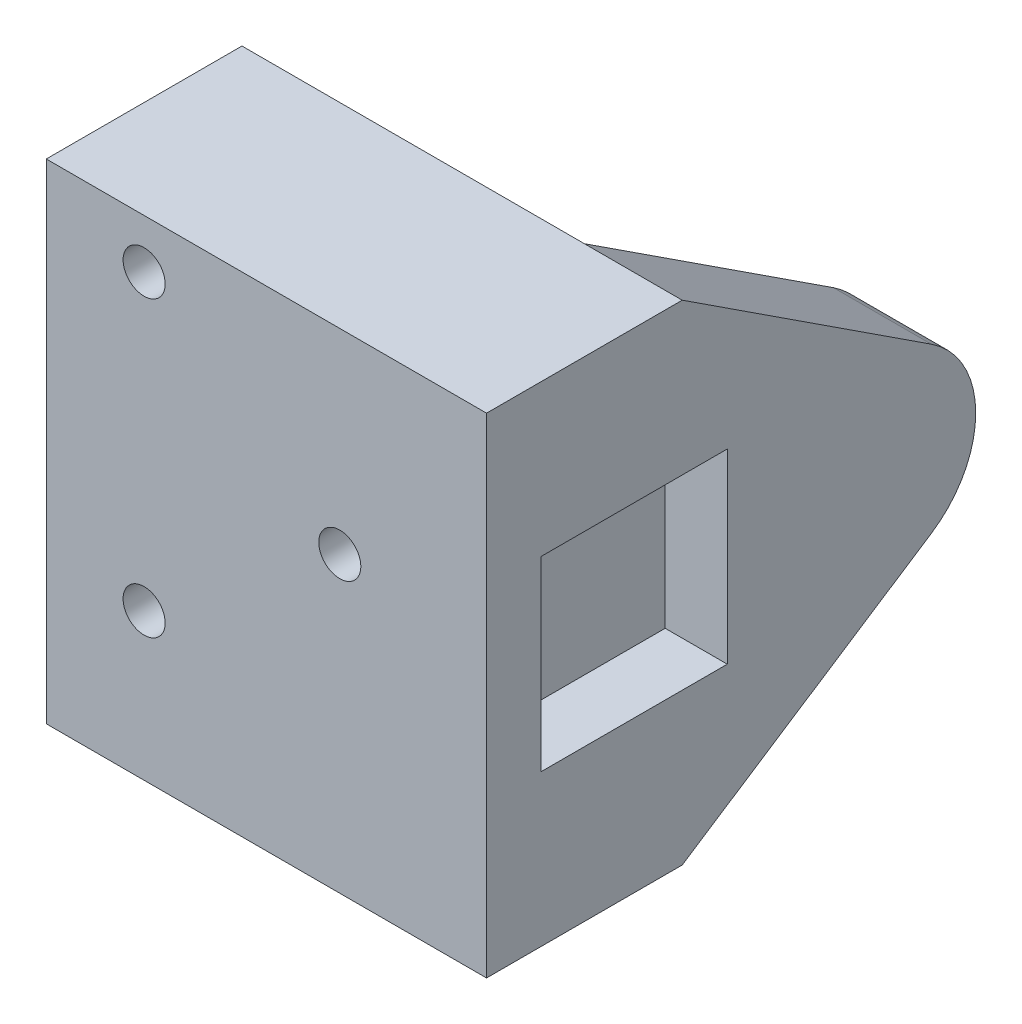
ISO-10303-21;
HEADER;
FILE_DESCRIPTION(('STEP AP214'),'2;1');
FILE_NAME('part.step','',(''),(''),'','','');
FILE_SCHEMA(('AUTOMOTIVE_DESIGN { 1 0 10303 214 1 1 1 1 }'));
ENDSEC;
DATA;
#1=APPLICATION_CONTEXT('core data for automotive mechanical design processes');
#2=APPLICATION_PROTOCOL_DEFINITION('international standard','automotive_design',2000,#1);
#3=PRODUCT_CONTEXT('',#1,'mechanical');
#4=PRODUCT('Part','Part','',(#3));
#5=PRODUCT_RELATED_PRODUCT_CATEGORY('part','',(#4));
#6=PRODUCT_DEFINITION_FORMATION('','',#4);
#7=PRODUCT_DEFINITION_CONTEXT('part definition',#1,'design');
#8=PRODUCT_DEFINITION('design','',#6,#7);
#9=PRODUCT_DEFINITION_SHAPE('','',#8);
#10=(LENGTH_UNIT() NAMED_UNIT(*) SI_UNIT(.MILLI.,.METRE.));
#11=(NAMED_UNIT(*) PLANE_ANGLE_UNIT() SI_UNIT($,.RADIAN.));
#12=(NAMED_UNIT(*) SI_UNIT($,.STERADIAN.) SOLID_ANGLE_UNIT());
#13=UNCERTAINTY_MEASURE_WITH_UNIT(LENGTH_MEASURE(1.E-05),#10,'distance_accuracy_value','');
#14=(GEOMETRIC_REPRESENTATION_CONTEXT(3) GLOBAL_UNCERTAINTY_ASSIGNED_CONTEXT((#13)) GLOBAL_UNIT_ASSIGNED_CONTEXT((#10,
#11,#12)) REPRESENTATION_CONTEXT('',''));
#15=CARTESIAN_POINT('',(0.,0.,0.));
#16=DIRECTION('',(0.,0.,1.));
#17=DIRECTION('',(1.,0.,0.));
#18=AXIS2_PLACEMENT_3D('',#15,#16,#17);
#19=CARTESIAN_POINT('',(0.,0.,0.));
#20=DIRECTION('',(1.,0.,0.));
#21=DIRECTION('',(0.,0.,-1.));
#22=AXIS2_PLACEMENT_3D('',#19,#20,#21);
#23=PLANE('',#22);
#24=DIRECTION('',(0.,-1.,0.));
#25=VECTOR('',#24,1.);
#26=CARTESIAN_POINT('',(0.,25.,0.));
#27=LINE('',#26,#25);
#28=CARTESIAN_POINT('',(0.,25.,0.));
#29=VERTEX_POINT('',#28);
#30=CARTESIAN_POINT('',(0.,-25.,0.));
#31=VERTEX_POINT('',#30);
#32=EDGE_CURVE('E83',#29,#31,#27,.T.);
#33=ORIENTED_EDGE('',*,*,#32,.F.);
#34=DIRECTION('',(0.,-0.546678357353442,-0.837342685882753));
#35=VECTOR('',#34,1.);
#36=CARTESIAN_POINT('',(0.,17.5285693400336,-11.4439281015076));
#37=LINE('',#36,#35);
#38=CARTESIAN_POINT('',(0.,8.37342685882754,-25.4667835735344));
#39=VERTEX_POINT('',#38);
#40=EDGE_CURVE('E109',#29,#39,#37,.T.);
#41=ORIENTED_EDGE('',*,*,#40,.T.);
#42=CARTESIAN_POINT('',(0.,0.,-20.));
#43=DIRECTION('',(1.,0.,0.));
#44=DIRECTION('',(0.,0.,-1.));
#45=AXIS2_PLACEMENT_3D('',#42,#43,#44);
#46=CIRCLE('',#45,10.);
#47=CARTESIAN_POINT('',(0.,-8.37342685882754,-25.4667835735344));
#48=VERTEX_POINT('',#47);
#49=EDGE_CURVE('E134',#39,#48,#46,.F.);
#50=ORIENTED_EDGE('',*,*,#49,.T.);
#51=DIRECTION('',(0.,-0.546678357353442,0.837342685882753));
#52=VECTOR('',#51,1.);
#53=CARTESIAN_POINT('',(0.,-17.5285693400336,-11.4439281015076));
#54=LINE('',#53,#52);
#55=EDGE_CURVE('E132',#48,#31,#54,.T.);
#56=ORIENTED_EDGE('',*,*,#55,.T.);
#57=EDGE_LOOP('',(#33,#41,#50,#56));
#58=FACE_BOUND('',#57,.T.);
#59=ADVANCED_FACE('F37',(#58),#23,.F.);
#60=CARTESIAN_POINT('',(10.,-25.,0.));
#61=DIRECTION('',(0.,1.,0.));
#62=DIRECTION('',(0.,0.,1.));
#63=AXIS2_PLACEMENT_3D('',#60,#61,#62);
#64=PLANE('',#63);
#65=DIRECTION('',(-1.,0.,0.));
#66=VECTOR('',#65,1.);
#67=CARTESIAN_POINT('',(10.,-25.,20.));
#68=LINE('',#67,#66);
#69=CARTESIAN_POINT('',(10.,-25.,20.));
#70=VERTEX_POINT('',#69);
#71=CARTESIAN_POINT('',(-35.,-25.,20.));
#72=VERTEX_POINT('',#71);
#73=EDGE_CURVE('E63',#70,#72,#68,.T.);
#74=ORIENTED_EDGE('',*,*,#73,.T.);
#75=DIRECTION('',(0.,0.,1.));
#76=VECTOR('',#75,1.);
#77=CARTESIAN_POINT('',(-35.,-25.,0.));
#78=LINE('',#77,#76);
#79=CARTESIAN_POINT('',(-35.,-25.,0.));
#80=VERTEX_POINT('',#79);
#81=EDGE_CURVE('E164',#80,#72,#78,.T.);
#82=ORIENTED_EDGE('',*,*,#81,.F.);
#83=DIRECTION('',(1.,0.,0.));
#84=VECTOR('',#83,1.);
#85=CARTESIAN_POINT('',(-35.,-25.,0.));
#86=LINE('',#85,#84);
#87=EDGE_CURVE('E176',#80,#31,#86,.T.);
#88=ORIENTED_EDGE('',*,*,#87,.T.);
#89=DIRECTION('',(-1.,0.,0.));
#90=VECTOR('',#89,1.);
#91=CARTESIAN_POINT('',(10.,-25.,0.));
#92=LINE('',#91,#90);
#93=CARTESIAN_POINT('',(10.,-25.,0.));
#94=VERTEX_POINT('',#93);
#95=EDGE_CURVE('E11',#94,#31,#92,.T.);
#96=ORIENTED_EDGE('',*,*,#95,.F.);
#97=DIRECTION('',(0.,0.,-1.));
#98=VECTOR('',#97,1.);
#99=CARTESIAN_POINT('',(10.,-25.,0.));
#100=LINE('',#99,#98);
#101=EDGE_CURVE('E91',#70,#94,#100,.T.);
#102=ORIENTED_EDGE('',*,*,#101,.F.);
#103=EDGE_LOOP('',(#74,#82,#88,#96,#102));
#104=FACE_BOUND('',#103,.T.);
#105=ADVANCED_FACE('F39',(#104),#64,.F.);
#106=CARTESIAN_POINT('',(10.,-17.5285693400336,-11.4439281015076));
#107=DIRECTION('',(0.,-0.837342685882753,-0.546678357353442));
#108=DIRECTION('',(0.,0.546678357353442,-0.837342685882753));
#109=AXIS2_PLACEMENT_3D('',#106,#107,#108);
#110=PLANE('',#109);
#111=ORIENTED_EDGE('',*,*,#55,.F.);
#112=DIRECTION('',(-1.,0.,0.));
#113=VECTOR('',#112,1.);
#114=CARTESIAN_POINT('',(10.,-8.37342685882754,-25.4667835735344));
#115=LINE('',#114,#113);
#116=CARTESIAN_POINT('',(10.,-8.37342685882754,-25.4667835735344));
#117=VERTEX_POINT('',#116);
#118=EDGE_CURVE('E46',#117,#48,#115,.T.);
#119=ORIENTED_EDGE('',*,*,#118,.F.);
#120=DIRECTION('',(0.,-0.546678357353442,0.837342685882753));
#121=VECTOR('',#120,1.);
#122=CARTESIAN_POINT('',(10.,-17.5285693400336,-11.4439281015076));
#123=LINE('',#122,#121);
#124=EDGE_CURVE('E211',#117,#94,#123,.T.);
#125=ORIENTED_EDGE('',*,*,#124,.T.);
#126=ORIENTED_EDGE('',*,*,#95,.T.);
#127=EDGE_LOOP('',(#111,#119,#125,#126));
#128=FACE_BOUND('',#127,.T.);
#129=ADVANCED_FACE('F222',(#128),#110,.T.);
#130=CARTESIAN_POINT('',(10.,0.,-20.));
#131=DIRECTION('',(-1.,0.,0.));
#132=DIRECTION('',(0.,0.,1.));
#133=AXIS2_PLACEMENT_3D('',#130,#131,#132);
#134=CYLINDRICAL_SURFACE('',#133,10.);
#135=ORIENTED_EDGE('',*,*,#49,.F.);
#136=DIRECTION('',(-1.,0.,0.));
#137=VECTOR('',#136,1.);
#138=CARTESIAN_POINT('',(10.,8.37342685882754,-25.4667835735344));
#139=LINE('',#138,#137);
#140=CARTESIAN_POINT('',(10.,8.37342685882754,-25.4667835735344));
#141=VERTEX_POINT('',#140);
#142=EDGE_CURVE('E114',#141,#39,#139,.T.);
#143=ORIENTED_EDGE('',*,*,#142,.F.);
#144=CARTESIAN_POINT('',(10.,0.,-20.));
#145=DIRECTION('',(1.,0.,0.));
#146=DIRECTION('',(0.,0.,-1.));
#147=AXIS2_PLACEMENT_3D('',#144,#145,#146);
#148=CIRCLE('',#147,10.);
#149=EDGE_CURVE('E122',#141,#117,#148,.F.);
#150=ORIENTED_EDGE('',*,*,#149,.T.);
#151=ORIENTED_EDGE('',*,*,#118,.T.);
#152=EDGE_LOOP('',(#135,#143,#150,#151));
#153=FACE_BOUND('',#152,.T.);
#154=ADVANCED_FACE('F215',(#153),#134,.T.);
#155=CARTESIAN_POINT('',(10.,17.5285693400336,-11.4439281015076));
#156=DIRECTION('',(0.,0.837342685882753,-0.546678357353442));
#157=DIRECTION('',(0.,0.546678357353442,0.837342685882753));
#158=AXIS2_PLACEMENT_3D('',#155,#156,#157);
#159=PLANE('',#158);
#160=ORIENTED_EDGE('',*,*,#40,.F.);
#161=DIRECTION('',(-1.,0.,0.));
#162=VECTOR('',#161,1.);
#163=CARTESIAN_POINT('',(10.,25.,0.));
#164=LINE('',#163,#162);
#165=CARTESIAN_POINT('',(10.,25.,0.));
#166=VERTEX_POINT('',#165);
#167=EDGE_CURVE('E105',#166,#29,#164,.T.);
#168=ORIENTED_EDGE('',*,*,#167,.F.);
#169=DIRECTION('',(0.,-0.546678357353442,-0.837342685882753));
#170=VECTOR('',#169,1.);
#171=CARTESIAN_POINT('',(10.,17.5285693400336,-11.4439281015076));
#172=LINE('',#171,#170);
#173=EDGE_CURVE('E108',#166,#141,#172,.T.);
#174=ORIENTED_EDGE('',*,*,#173,.T.);
#175=ORIENTED_EDGE('',*,*,#142,.T.);
#176=EDGE_LOOP('',(#160,#168,#174,#175));
#177=FACE_BOUND('',#176,.T.);
#178=ADVANCED_FACE('F107',(#177),#159,.T.);
#179=CARTESIAN_POINT('',(10.,25.,0.));
#180=DIRECTION('',(0.,1.,0.));
#181=DIRECTION('',(0.,0.,1.));
#182=AXIS2_PLACEMENT_3D('',#179,#180,#181);
#183=PLANE('',#182);
#184=ORIENTED_EDGE('',*,*,#167,.T.);
#185=DIRECTION('',(1.,0.,0.));
#186=VECTOR('',#185,1.);
#187=CARTESIAN_POINT('',(-35.,25.,0.));
#188=LINE('',#187,#186);
#189=CARTESIAN_POINT('',(-35.,25.,0.));
#190=VERTEX_POINT('',#189);
#191=EDGE_CURVE('E173',#190,#29,#188,.T.);
#192=ORIENTED_EDGE('',*,*,#191,.F.);
#193=DIRECTION('',(0.,0.,-1.));
#194=VECTOR('',#193,1.);
#195=CARTESIAN_POINT('',(-35.,25.,0.));
#196=LINE('',#195,#194);
#197=CARTESIAN_POINT('',(-35.,25.,20.));
#198=VERTEX_POINT('',#197);
#199=EDGE_CURVE('E170',#198,#190,#196,.T.);
#200=ORIENTED_EDGE('',*,*,#199,.F.);
#201=DIRECTION('',(-1.,0.,0.));
#202=VECTOR('',#201,1.);
#203=CARTESIAN_POINT('',(10.,25.,20.));
#204=LINE('',#203,#202);
#205=CARTESIAN_POINT('',(10.,25.,20.));
#206=VERTEX_POINT('',#205);
#207=EDGE_CURVE('E115',#206,#198,#204,.T.);
#208=ORIENTED_EDGE('',*,*,#207,.F.);
#209=DIRECTION('',(0.,0.,-1.));
#210=VECTOR('',#209,1.);
#211=CARTESIAN_POINT('',(10.,25.,0.));
#212=LINE('',#211,#210);
#213=EDGE_CURVE('E120',#206,#166,#212,.T.);
#214=ORIENTED_EDGE('',*,*,#213,.T.);
#215=EDGE_LOOP('',(#184,#192,#200,#208,#214));
#216=FACE_BOUND('',#215,.T.);
#217=ADVANCED_FACE('F124',(#216),#183,.T.);
#218=CARTESIAN_POINT('',(10.,0.,20.));
#219=DIRECTION('',(0.,0.,1.));
#220=DIRECTION('',(1.,0.,0.));
#221=AXIS2_PLACEMENT_3D('',#218,#219,#220);
#222=PLANE('',#221);
#223=CARTESIAN_POINT('',(-25.,20.,20.));
#224=DIRECTION('',(0.,0.,1.));
#225=DIRECTION('',(1.,0.,0.));
#226=AXIS2_PLACEMENT_3D('',#223,#224,#225);
#227=CIRCLE('',#226,2.15);
#228=CARTESIAN_POINT('',(-22.85,20.,20.));
#229=VERTEX_POINT('',#228);
#230=EDGE_CURVE('E156',#229,#229,#227,.T.);
#231=ORIENTED_EDGE('',*,*,#230,.F.);
#232=EDGE_LOOP('',(#231));
#233=FACE_BOUND('',#232,.T.);
#234=CARTESIAN_POINT('',(-25.,-10.,20.));
#235=DIRECTION('',(0.,0.,1.));
#236=DIRECTION('',(1.,0.,0.));
#237=AXIS2_PLACEMENT_3D('',#234,#235,#236);
#238=CIRCLE('',#237,2.15);
#239=CARTESIAN_POINT('',(-22.85,-10.,20.));
#240=VERTEX_POINT('',#239);
#241=EDGE_CURVE('E145',#240,#240,#238,.T.);
#242=ORIENTED_EDGE('',*,*,#241,.F.);
#243=EDGE_LOOP('',(#242));
#244=FACE_BOUND('',#243,.T.);
#245=CARTESIAN_POINT('',(-5.,5.,20.));
#246=DIRECTION('',(0.,0.,1.));
#247=DIRECTION('',(1.,0.,0.));
#248=AXIS2_PLACEMENT_3D('',#245,#246,#247);
#249=CIRCLE('',#248,2.15);
#250=CARTESIAN_POINT('',(-2.85,5.,20.));
#251=VERTEX_POINT('',#250);
#252=EDGE_CURVE('E144',#251,#251,#249,.T.);
#253=ORIENTED_EDGE('',*,*,#252,.F.);
#254=EDGE_LOOP('',(#253));
#255=FACE_BOUND('',#254,.T.);
#256=ORIENTED_EDGE('',*,*,#207,.T.);
#257=DIRECTION('',(0.,1.,0.));
#258=VECTOR('',#257,1.);
#259=CARTESIAN_POINT('',(-35.,25.,20.));
#260=LINE('',#259,#258);
#261=EDGE_CURVE('E167',#72,#198,#260,.T.);
#262=ORIENTED_EDGE('',*,*,#261,.F.);
#263=ORIENTED_EDGE('',*,*,#73,.F.);
#264=DIRECTION('',(0.,1.,0.));
#265=VECTOR('',#264,1.);
#266=CARTESIAN_POINT('',(10.,0.,20.));
#267=LINE('',#266,#265);
#268=EDGE_CURVE('E127',#70,#206,#267,.T.);
#269=ORIENTED_EDGE('',*,*,#268,.T.);
#270=EDGE_LOOP('',(#256,#262,#263,#269));
#271=FACE_BOUND('',#270,.T.);
#272=ADVANCED_FACE('F227',(#233,#244,#255,#271),#222,.T.);
#273=CARTESIAN_POINT('',(10.,0.,0.));
#274=DIRECTION('',(1.,0.,0.));
#275=DIRECTION('',(0.,0.,-1.));
#276=AXIS2_PLACEMENT_3D('',#273,#274,#275);
#277=PLANE('',#276);
#278=DIRECTION('',(0.,-1.,0.));
#279=VECTOR('',#278,1.);
#280=CARTESIAN_POINT('',(10.,9.525,14.4405658787244));
#281=LINE('',#280,#279);
#282=CARTESIAN_POINT('',(10.,9.525,14.4405658787244));
#283=VERTEX_POINT('',#282);
#284=CARTESIAN_POINT('',(10.,-9.525,14.4405658787244));
#285=VERTEX_POINT('',#284);
#286=EDGE_CURVE('E54',#283,#285,#281,.T.);
#287=ORIENTED_EDGE('',*,*,#286,.F.);
#288=DIRECTION('',(0.,0.,1.));
#289=VECTOR('',#288,1.);
#290=CARTESIAN_POINT('',(10.,9.525,14.4405658787244));
#291=LINE('',#290,#289);
#292=CARTESIAN_POINT('',(10.,9.525,-4.6094341212756));
#293=VERTEX_POINT('',#292);
#294=EDGE_CURVE('E183',#293,#283,#291,.T.);
#295=ORIENTED_EDGE('',*,*,#294,.F.);
#296=DIRECTION('',(0.,1.,0.));
#297=VECTOR('',#296,1.);
#298=CARTESIAN_POINT('',(10.,9.525,-4.6094341212756));
#299=LINE('',#298,#297);
#300=CARTESIAN_POINT('',(10.,-9.525,-4.6094341212756));
#301=VERTEX_POINT('',#300);
#302=EDGE_CURVE('E197',#301,#293,#299,.T.);
#303=ORIENTED_EDGE('',*,*,#302,.F.);
#304=DIRECTION('',(0.,0.,-1.));
#305=VECTOR('',#304,1.);
#306=CARTESIAN_POINT('',(10.,-9.525,14.4405658787244));
#307=LINE('',#306,#305);
#308=EDGE_CURVE('E194',#285,#301,#307,.T.);
#309=ORIENTED_EDGE('',*,*,#308,.F.);
#310=EDGE_LOOP('',(#287,#295,#303,#309));
#311=FACE_BOUND('',#310,.T.);
#312=ORIENTED_EDGE('',*,*,#101,.T.);
#313=ORIENTED_EDGE('',*,*,#124,.F.);
#314=ORIENTED_EDGE('',*,*,#149,.F.);
#315=ORIENTED_EDGE('',*,*,#173,.F.);
#316=ORIENTED_EDGE('',*,*,#213,.F.);
#317=ORIENTED_EDGE('',*,*,#268,.F.);
#318=EDGE_LOOP('',(#312,#313,#314,#315,#316,#317));
#319=FACE_BOUND('',#318,.T.);
#320=ADVANCED_FACE('F119',(#311,#319),#277,.T.);
#321=CARTESIAN_POINT('',(3.65,9.525,14.4405658787244));
#322=DIRECTION('',(0.,0.,1.));
#323=DIRECTION('',(1.,0.,0.));
#324=AXIS2_PLACEMENT_3D('',#321,#322,#323);
#325=PLANE('',#324);
#326=ORIENTED_EDGE('',*,*,#286,.T.);
#327=DIRECTION('',(1.,0.,0.));
#328=VECTOR('',#327,1.);
#329=CARTESIAN_POINT('',(3.65,-9.525,14.4405658787244));
#330=LINE('',#329,#328);
#331=CARTESIAN_POINT('',(3.65,-9.525,14.4405658787244));
#332=VERTEX_POINT('',#331);
#333=EDGE_CURVE('E192',#332,#285,#330,.T.);
#334=ORIENTED_EDGE('',*,*,#333,.F.);
#335=DIRECTION('',(0.,-1.,0.));
#336=VECTOR('',#335,1.);
#337=CARTESIAN_POINT('',(3.65,9.525,14.4405658787244));
#338=LINE('',#337,#336);
#339=CARTESIAN_POINT('',(3.65,9.525,14.4405658787244));
#340=VERTEX_POINT('',#339);
#341=EDGE_CURVE('E179',#340,#332,#338,.T.);
#342=ORIENTED_EDGE('',*,*,#341,.F.);
#343=DIRECTION('',(1.,0.,0.));
#344=VECTOR('',#343,1.);
#345=CARTESIAN_POINT('',(3.65,9.525,14.4405658787244));
#346=LINE('',#345,#344);
#347=EDGE_CURVE('E135',#340,#283,#346,.T.);
#348=ORIENTED_EDGE('',*,*,#347,.T.);
#349=EDGE_LOOP('',(#326,#334,#342,#348));
#350=FACE_BOUND('',#349,.T.);
#351=ADVANCED_FACE('F265',(#350),#325,.F.);
#352=CARTESIAN_POINT('',(3.65,9.525,14.4405658787244));
#353=DIRECTION('',(0.,1.,0.));
#354=DIRECTION('',(0.,0.,1.));
#355=AXIS2_PLACEMENT_3D('',#352,#353,#354);
#356=PLANE('',#355);
#357=ORIENTED_EDGE('',*,*,#294,.T.);
#358=ORIENTED_EDGE('',*,*,#347,.F.);
#359=DIRECTION('',(0.,0.,1.));
#360=VECTOR('',#359,1.);
#361=CARTESIAN_POINT('',(3.65,9.525,14.4405658787244));
#362=LINE('',#361,#360);
#363=CARTESIAN_POINT('',(3.65,9.525,-4.6094341212756));
#364=VERTEX_POINT('',#363);
#365=EDGE_CURVE('E189',#364,#340,#362,.T.);
#366=ORIENTED_EDGE('',*,*,#365,.F.);
#367=DIRECTION('',(1.,0.,0.));
#368=VECTOR('',#367,1.);
#369=CARTESIAN_POINT('',(3.65,9.525,-4.6094341212756));
#370=LINE('',#369,#368);
#371=EDGE_CURVE('E203',#364,#293,#370,.T.);
#372=ORIENTED_EDGE('',*,*,#371,.T.);
#373=EDGE_LOOP('',(#357,#358,#366,#372));
#374=FACE_BOUND('',#373,.T.);
#375=ADVANCED_FACE('F267',(#374),#356,.F.);
#376=CARTESIAN_POINT('',(3.65,9.525,-4.6094341212756));
#377=DIRECTION('',(0.,0.,-1.));
#378=DIRECTION('',(-1.,0.,0.));
#379=AXIS2_PLACEMENT_3D('',#376,#377,#378);
#380=PLANE('',#379);
#381=ORIENTED_EDGE('',*,*,#302,.T.);
#382=ORIENTED_EDGE('',*,*,#371,.F.);
#383=DIRECTION('',(0.,1.,0.));
#384=VECTOR('',#383,1.);
#385=CARTESIAN_POINT('',(3.65,9.525,-4.6094341212756));
#386=LINE('',#385,#384);
#387=CARTESIAN_POINT('',(3.65,-9.525,-4.6094341212756));
#388=VERTEX_POINT('',#387);
#389=EDGE_CURVE('E186',#388,#364,#386,.T.);
#390=ORIENTED_EDGE('',*,*,#389,.F.);
#391=DIRECTION('',(1.,0.,0.));
#392=VECTOR('',#391,1.);
#393=CARTESIAN_POINT('',(3.65,-9.525,-4.6094341212756));
#394=LINE('',#393,#392);
#395=EDGE_CURVE('E206',#388,#301,#394,.T.);
#396=ORIENTED_EDGE('',*,*,#395,.T.);
#397=EDGE_LOOP('',(#381,#382,#390,#396));
#398=FACE_BOUND('',#397,.T.);
#399=ADVANCED_FACE('F278',(#398),#380,.F.);
#400=CARTESIAN_POINT('',(3.65,-9.525,14.4405658787244));
#401=DIRECTION('',(0.,-1.,0.));
#402=DIRECTION('',(0.,0.,-1.));
#403=AXIS2_PLACEMENT_3D('',#400,#401,#402);
#404=PLANE('',#403);
#405=ORIENTED_EDGE('',*,*,#308,.T.);
#406=ORIENTED_EDGE('',*,*,#395,.F.);
#407=DIRECTION('',(0.,0.,-1.));
#408=VECTOR('',#407,1.);
#409=CARTESIAN_POINT('',(3.65,-9.525,14.4405658787244));
#410=LINE('',#409,#408);
#411=EDGE_CURVE('E182',#332,#388,#410,.T.);
#412=ORIENTED_EDGE('',*,*,#411,.F.);
#413=ORIENTED_EDGE('',*,*,#333,.T.);
#414=EDGE_LOOP('',(#405,#406,#412,#413));
#415=FACE_BOUND('',#414,.T.);
#416=ADVANCED_FACE('F272',(#415),#404,.F.);
#417=CARTESIAN_POINT('',(3.65,0.,0.));
#418=DIRECTION('',(1.,0.,0.));
#419=DIRECTION('',(0.,0.,-1.));
#420=AXIS2_PLACEMENT_3D('',#417,#418,#419);
#421=PLANE('',#420);
#422=ORIENTED_EDGE('',*,*,#341,.T.);
#423=ORIENTED_EDGE('',*,*,#411,.T.);
#424=ORIENTED_EDGE('',*,*,#389,.T.);
#425=ORIENTED_EDGE('',*,*,#365,.T.);
#426=EDGE_LOOP('',(#422,#423,#424,#425));
#427=FACE_BOUND('',#426,.T.);
#428=ADVANCED_FACE('F276',(#427),#421,.T.);
#429=CARTESIAN_POINT('',(-35.,25.,0.));
#430=DIRECTION('',(0.,0.,1.));
#431=DIRECTION('',(1.,0.,0.));
#432=AXIS2_PLACEMENT_3D('',#429,#430,#431);
#433=PLANE('',#432);
#434=CARTESIAN_POINT('',(-25.,20.,0.));
#435=DIRECTION('',(0.,0.,1.));
#436=DIRECTION('',(1.,0.,0.));
#437=AXIS2_PLACEMENT_3D('',#434,#435,#436);
#438=CIRCLE('',#437,2.15);
#439=CARTESIAN_POINT('',(-22.85,20.,0.));
#440=VERTEX_POINT('',#439);
#441=EDGE_CURVE('E41',#440,#440,#438,.T.);
#442=ORIENTED_EDGE('',*,*,#441,.T.);
#443=EDGE_LOOP('',(#442));
#444=FACE_BOUND('',#443,.T.);
#445=CARTESIAN_POINT('',(-25.,-10.,0.));
#446=DIRECTION('',(0.,0.,1.));
#447=DIRECTION('',(1.,0.,0.));
#448=AXIS2_PLACEMENT_3D('',#445,#446,#447);
#449=CIRCLE('',#448,2.15);
#450=CARTESIAN_POINT('',(-22.85,-10.,0.));
#451=VERTEX_POINT('',#450);
#452=EDGE_CURVE('E142',#451,#451,#449,.T.);
#453=ORIENTED_EDGE('',*,*,#452,.T.);
#454=EDGE_LOOP('',(#453));
#455=FACE_BOUND('',#454,.T.);
#456=CARTESIAN_POINT('',(-5.,5.,0.));
#457=DIRECTION('',(0.,0.,1.));
#458=DIRECTION('',(1.,0.,0.));
#459=AXIS2_PLACEMENT_3D('',#456,#457,#458);
#460=CIRCLE('',#459,2.15);
#461=CARTESIAN_POINT('',(-2.85,5.,0.));
#462=VERTEX_POINT('',#461);
#463=EDGE_CURVE('E149',#462,#462,#460,.T.);
#464=ORIENTED_EDGE('',*,*,#463,.T.);
#465=EDGE_LOOP('',(#464));
#466=FACE_BOUND('',#465,.T.);
#467=ORIENTED_EDGE('',*,*,#32,.T.);
#468=ORIENTED_EDGE('',*,*,#87,.F.);
#469=DIRECTION('',(0.,-1.,0.));
#470=VECTOR('',#469,1.);
#471=CARTESIAN_POINT('',(-35.,25.,0.));
#472=LINE('',#471,#470);
#473=EDGE_CURVE('E161',#190,#80,#472,.T.);
#474=ORIENTED_EDGE('',*,*,#473,.F.);
#475=ORIENTED_EDGE('',*,*,#191,.T.);
#476=EDGE_LOOP('',(#467,#468,#474,#475));
#477=FACE_BOUND('',#476,.T.);
#478=ADVANCED_FACE('F344',(#444,#455,#466,#477),#433,.F.);
#479=CARTESIAN_POINT('',(-35.,0.,0.));
#480=DIRECTION('',(-1.,0.,0.));
#481=DIRECTION('',(0.,0.,1.));
#482=AXIS2_PLACEMENT_3D('',#479,#480,#481);
#483=PLANE('',#482);
#484=ORIENTED_EDGE('',*,*,#473,.T.);
#485=ORIENTED_EDGE('',*,*,#81,.T.);
#486=ORIENTED_EDGE('',*,*,#261,.T.);
#487=ORIENTED_EDGE('',*,*,#199,.T.);
#488=EDGE_LOOP('',(#484,#485,#486,#487));
#489=FACE_BOUND('',#488,.T.);
#490=ADVANCED_FACE('F349',(#489),#483,.T.);
#491=CARTESIAN_POINT('',(-5.,5.,20.));
#492=DIRECTION('',(0.,0.,1.));
#493=DIRECTION('',(1.,0.,0.));
#494=AXIS2_PLACEMENT_3D('',#491,#492,#493);
#495=CYLINDRICAL_SURFACE('',#494,2.15);
#496=ORIENTED_EDGE('',*,*,#252,.T.);
#497=EDGE_LOOP('',(#496));
#498=FACE_BOUND('',#497,.T.);
#499=ORIENTED_EDGE('',*,*,#463,.F.);
#500=EDGE_LOOP('',(#499));
#501=FACE_BOUND('',#500,.T.);
#502=ADVANCED_FACE('F358',(#498,#501),#495,.F.);
#503=CARTESIAN_POINT('',(-25.,-10.,20.));
#504=DIRECTION('',(0.,0.,1.));
#505=DIRECTION('',(1.,0.,0.));
#506=AXIS2_PLACEMENT_3D('',#503,#504,#505);
#507=CYLINDRICAL_SURFACE('',#506,2.15);
#508=ORIENTED_EDGE('',*,*,#241,.T.);
#509=EDGE_LOOP('',(#508));
#510=FACE_BOUND('',#509,.T.);
#511=ORIENTED_EDGE('',*,*,#452,.F.);
#512=EDGE_LOOP('',(#511));
#513=FACE_BOUND('',#512,.T.);
#514=ADVANCED_FACE('F366',(#510,#513),#507,.F.);
#515=CARTESIAN_POINT('',(-25.,20.,20.));
#516=DIRECTION('',(0.,0.,1.));
#517=DIRECTION('',(1.,0.,0.));
#518=AXIS2_PLACEMENT_3D('',#515,#516,#517);
#519=CYLINDRICAL_SURFACE('',#518,2.15);
#520=ORIENTED_EDGE('',*,*,#230,.T.);
#521=EDGE_LOOP('',(#520));
#522=FACE_BOUND('',#521,.T.);
#523=ORIENTED_EDGE('',*,*,#441,.F.);
#524=EDGE_LOOP('',(#523));
#525=FACE_BOUND('',#524,.T.);
#526=ADVANCED_FACE('F375',(#522,#525),#519,.F.);
#527=CLOSED_SHELL('',(#59,#105,#129,#154,#178,#217,#272,#320,#351,#375,#399,#416,#428,#478,#490,
#502,#514,#526));
#528=MANIFOLD_SOLID_BREP('B2',#527);
#529=ADVANCED_BREP_SHAPE_REPRESENTATION('',(#18,#528),#14);
#530=SHAPE_DEFINITION_REPRESENTATION(#9,#529);
ENDSEC;
END-ISO-10303-21;
